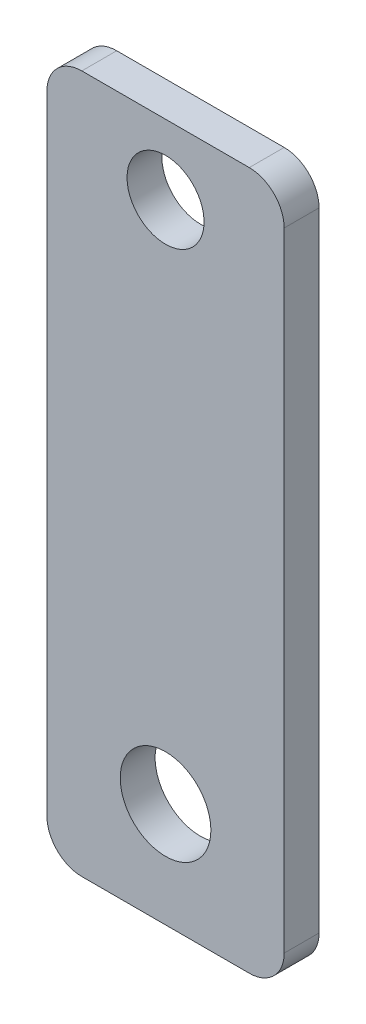
ISO-10303-21;
HEADER;
FILE_DESCRIPTION(('STEP AP214'),'2;1');
FILE_NAME('part.step','',(''),(''),'','','');
FILE_SCHEMA(('AUTOMOTIVE_DESIGN { 1 0 10303 214 1 1 1 1 }'));
ENDSEC;
DATA;
#1=APPLICATION_CONTEXT('core data for automotive mechanical design processes');
#2=APPLICATION_PROTOCOL_DEFINITION('international standard','automotive_design',2000,#1);
#3=PRODUCT_CONTEXT('',#1,'mechanical');
#4=PRODUCT('Part','Part','',(#3));
#5=PRODUCT_RELATED_PRODUCT_CATEGORY('part','',(#4));
#6=PRODUCT_DEFINITION_FORMATION('','',#4);
#7=PRODUCT_DEFINITION_CONTEXT('part definition',#1,'design');
#8=PRODUCT_DEFINITION('design','',#6,#7);
#9=PRODUCT_DEFINITION_SHAPE('','',#8);
#10=(LENGTH_UNIT() NAMED_UNIT(*) SI_UNIT(.MILLI.,.METRE.));
#11=(NAMED_UNIT(*) PLANE_ANGLE_UNIT() SI_UNIT($,.RADIAN.));
#12=(NAMED_UNIT(*) SI_UNIT($,.STERADIAN.) SOLID_ANGLE_UNIT());
#13=UNCERTAINTY_MEASURE_WITH_UNIT(LENGTH_MEASURE(1.E-05),#10,'distance_accuracy_value','');
#14=(GEOMETRIC_REPRESENTATION_CONTEXT(3) GLOBAL_UNCERTAINTY_ASSIGNED_CONTEXT((#13)) GLOBAL_UNIT_ASSIGNED_CONTEXT((#10,
#11,#12)) REPRESENTATION_CONTEXT('',''));
#15=CARTESIAN_POINT('',(0.,0.,0.));
#16=DIRECTION('',(0.,0.,1.));
#17=DIRECTION('',(1.,0.,0.));
#18=AXIS2_PLACEMENT_3D('',#15,#16,#17);
#19=CARTESIAN_POINT('',(0.,0.,3.175));
#20=DIRECTION('',(0.,0.,-1.));
#21=DIRECTION('',(-1.,0.,0.));
#22=AXIS2_PLACEMENT_3D('',#19,#20,#21);
#23=PLANE('',#22);
#24=CARTESIAN_POINT('',(10.795,57.15,3.175));
#25=DIRECTION('',(0.,0.,-1.));
#26=DIRECTION('',(-1.,0.,0.));
#27=AXIS2_PLACEMENT_3D('',#24,#25,#26);
#28=CIRCLE('',#27,3.5052);
#29=CARTESIAN_POINT('',(7.2898,57.15,3.175));
#30=VERTEX_POINT('',#29);
#31=EDGE_CURVE('E257',#30,#30,#28,.T.);
#32=ORIENTED_EDGE('',*,*,#31,.T.);
#33=EDGE_LOOP('',(#32));
#34=FACE_BOUND('',#33,.T.);
#35=DIRECTION('',(0.,1.,0.));
#36=VECTOR('',#35,1.);
#37=CARTESIAN_POINT('',(21.59,0.,3.175));
#38=LINE('',#37,#36);
#39=CARTESIAN_POINT('',(21.59,3.175,3.175));
#40=VERTEX_POINT('',#39);
#41=CARTESIAN_POINT('',(21.59,60.325,3.175));
#42=VERTEX_POINT('',#41);
#43=EDGE_CURVE('E162',#40,#42,#38,.T.);
#44=ORIENTED_EDGE('',*,*,#43,.T.);
#45=CARTESIAN_POINT('',(18.415,60.325,3.175));
#46=DIRECTION('',(0.,0.,-1.));
#47=DIRECTION('',(-1.,0.,0.));
#48=AXIS2_PLACEMENT_3D('',#45,#46,#47);
#49=CIRCLE('',#48,3.175);
#50=CARTESIAN_POINT('',(18.415,63.5,3.175));
#51=VERTEX_POINT('',#50);
#52=EDGE_CURVE('E180',#42,#51,#49,.F.);
#53=ORIENTED_EDGE('',*,*,#52,.T.);
#54=DIRECTION('',(1.,0.,0.));
#55=VECTOR('',#54,1.);
#56=CARTESIAN_POINT('',(0.,63.5,3.175));
#57=LINE('',#56,#55);
#58=CARTESIAN_POINT('',(3.175,63.5,3.175));
#59=VERTEX_POINT('',#58);
#60=EDGE_CURVE('E190',#59,#51,#57,.T.);
#61=ORIENTED_EDGE('',*,*,#60,.F.);
#62=CARTESIAN_POINT('',(3.175,60.325,3.175));
#63=DIRECTION('',(0.,0.,-1.));
#64=DIRECTION('',(-1.,0.,0.));
#65=AXIS2_PLACEMENT_3D('',#62,#63,#64);
#66=CIRCLE('',#65,3.175);
#67=CARTESIAN_POINT('',(0.,60.325,3.175));
#68=VERTEX_POINT('',#67);
#69=EDGE_CURVE('E157',#59,#68,#66,.F.);
#70=ORIENTED_EDGE('',*,*,#69,.T.);
#71=DIRECTION('',(0.,1.,0.));
#72=VECTOR('',#71,1.);
#73=CARTESIAN_POINT('',(0.,0.,3.175));
#74=LINE('',#73,#72);
#75=CARTESIAN_POINT('',(0.,3.175,3.175));
#76=VERTEX_POINT('',#75);
#77=EDGE_CURVE('E189',#76,#68,#74,.T.);
#78=ORIENTED_EDGE('',*,*,#77,.F.);
#79=CARTESIAN_POINT('',(3.175,3.175,3.175));
#80=DIRECTION('',(0.,0.,-1.));
#81=DIRECTION('',(-1.,0.,0.));
#82=AXIS2_PLACEMENT_3D('',#79,#80,#81);
#83=CIRCLE('',#82,3.175);
#84=CARTESIAN_POINT('',(3.175,0.,3.175));
#85=VERTEX_POINT('',#84);
#86=EDGE_CURVE('E86',#76,#85,#83,.F.);
#87=ORIENTED_EDGE('',*,*,#86,.T.);
#88=DIRECTION('',(1.,0.,0.));
#89=VECTOR('',#88,1.);
#90=CARTESIAN_POINT('',(0.,0.,3.175));
#91=LINE('',#90,#89);
#92=CARTESIAN_POINT('',(18.415,0.,3.175));
#93=VERTEX_POINT('',#92);
#94=EDGE_CURVE('E158',#85,#93,#91,.T.);
#95=ORIENTED_EDGE('',*,*,#94,.T.);
#96=CARTESIAN_POINT('',(18.415,3.175,3.175));
#97=DIRECTION('',(0.,0.,-1.));
#98=DIRECTION('',(-1.,0.,0.));
#99=AXIS2_PLACEMENT_3D('',#96,#97,#98);
#100=CIRCLE('',#99,3.175);
#101=EDGE_CURVE('E176',#93,#40,#100,.F.);
#102=ORIENTED_EDGE('',*,*,#101,.T.);
#103=EDGE_LOOP('',(#44,#53,#61,#70,#78,#87,#95,#102));
#104=FACE_BOUND('',#103,.T.);
#105=CARTESIAN_POINT('',(10.795,9.525,3.175));
#106=DIRECTION('',(0.,0.,1.));
#107=DIRECTION('',(1.,0.,0.));
#108=AXIS2_PLACEMENT_3D('',#105,#106,#107);
#109=CIRCLE('',#108,4.12499987799996);
#110=CARTESIAN_POINT('',(14.919999878,9.525,3.175));
#111=VERTEX_POINT('',#110);
#112=EDGE_CURVE('E199',#111,#111,#109,.T.);
#113=ORIENTED_EDGE('',*,*,#112,.F.);
#114=EDGE_LOOP('',(#113));
#115=FACE_BOUND('',#114,.T.);
#116=ADVANCED_FACE('F65',(#34,#104,#115),#23,.F.);
#117=CARTESIAN_POINT('',(0.,0.,0.));
#118=DIRECTION('',(0.,0.,-1.));
#119=DIRECTION('',(-1.,0.,0.));
#120=AXIS2_PLACEMENT_3D('',#117,#118,#119);
#121=PLANE('',#120);
#122=CARTESIAN_POINT('',(10.795,57.15,0.));
#123=DIRECTION('',(0.,0.,-1.));
#124=DIRECTION('',(-1.,0.,0.));
#125=AXIS2_PLACEMENT_3D('',#122,#123,#124);
#126=CIRCLE('',#125,3.5052);
#127=CARTESIAN_POINT('',(7.2898,57.15,0.));
#128=VERTEX_POINT('',#127);
#129=EDGE_CURVE('E260',#128,#128,#126,.T.);
#130=ORIENTED_EDGE('',*,*,#129,.F.);
#131=EDGE_LOOP('',(#130));
#132=FACE_BOUND('',#131,.T.);
#133=DIRECTION('',(1.,0.,0.));
#134=VECTOR('',#133,1.);
#135=CARTESIAN_POINT('',(0.,63.5,0.));
#136=LINE('',#135,#134);
#137=CARTESIAN_POINT('',(3.175,63.5,0.));
#138=VERTEX_POINT('',#137);
#139=CARTESIAN_POINT('',(18.415,63.5,0.));
#140=VERTEX_POINT('',#139);
#141=EDGE_CURVE('E135',#138,#140,#136,.T.);
#142=ORIENTED_EDGE('',*,*,#141,.T.);
#143=CARTESIAN_POINT('',(18.415,60.325,0.));
#144=DIRECTION('',(0.,0.,-1.));
#145=DIRECTION('',(-1.,0.,0.));
#146=AXIS2_PLACEMENT_3D('',#143,#144,#145);
#147=CIRCLE('',#146,3.175);
#148=CARTESIAN_POINT('',(21.59,60.325,0.));
#149=VERTEX_POINT('',#148);
#150=EDGE_CURVE('E142',#140,#149,#147,.T.);
#151=ORIENTED_EDGE('',*,*,#150,.T.);
#152=DIRECTION('',(0.,1.,0.));
#153=VECTOR('',#152,1.);
#154=CARTESIAN_POINT('',(21.59,0.,0.));
#155=LINE('',#154,#153);
#156=CARTESIAN_POINT('',(21.59,3.175,0.));
#157=VERTEX_POINT('',#156);
#158=EDGE_CURVE('E153',#157,#149,#155,.T.);
#159=ORIENTED_EDGE('',*,*,#158,.F.);
#160=CARTESIAN_POINT('',(18.415,3.175,0.));
#161=DIRECTION('',(0.,0.,-1.));
#162=DIRECTION('',(-1.,0.,0.));
#163=AXIS2_PLACEMENT_3D('',#160,#161,#162);
#164=CIRCLE('',#163,3.175);
#165=CARTESIAN_POINT('',(18.415,0.,0.));
#166=VERTEX_POINT('',#165);
#167=EDGE_CURVE('E160',#157,#166,#164,.T.);
#168=ORIENTED_EDGE('',*,*,#167,.T.);
#169=DIRECTION('',(1.,0.,0.));
#170=VECTOR('',#169,1.);
#171=CARTESIAN_POINT('',(0.,0.,0.));
#172=LINE('',#171,#170);
#173=CARTESIAN_POINT('',(3.175,0.,0.));
#174=VERTEX_POINT('',#173);
#175=EDGE_CURVE('E165',#174,#166,#172,.T.);
#176=ORIENTED_EDGE('',*,*,#175,.F.);
#177=CARTESIAN_POINT('',(3.175,3.175,0.));
#178=DIRECTION('',(0.,0.,-1.));
#179=DIRECTION('',(-1.,0.,0.));
#180=AXIS2_PLACEMENT_3D('',#177,#178,#179);
#181=CIRCLE('',#180,3.175);
#182=CARTESIAN_POINT('',(0.,3.175,0.));
#183=VERTEX_POINT('',#182);
#184=EDGE_CURVE('E143',#174,#183,#181,.T.);
#185=ORIENTED_EDGE('',*,*,#184,.T.);
#186=DIRECTION('',(0.,1.,0.));
#187=VECTOR('',#186,1.);
#188=CARTESIAN_POINT('',(0.,0.,0.));
#189=LINE('',#188,#187);
#190=CARTESIAN_POINT('',(0.,60.325,0.));
#191=VERTEX_POINT('',#190);
#192=EDGE_CURVE('E137',#183,#191,#189,.T.);
#193=ORIENTED_EDGE('',*,*,#192,.T.);
#194=CARTESIAN_POINT('',(3.175,60.325,0.));
#195=DIRECTION('',(0.,0.,-1.));
#196=DIRECTION('',(-1.,0.,0.));
#197=AXIS2_PLACEMENT_3D('',#194,#195,#196);
#198=CIRCLE('',#197,3.175);
#199=EDGE_CURVE('E131',#191,#138,#198,.T.);
#200=ORIENTED_EDGE('',*,*,#199,.T.);
#201=EDGE_LOOP('',(#142,#151,#159,#168,#176,#185,#193,#200));
#202=FACE_BOUND('',#201,.T.);
#203=CARTESIAN_POINT('',(10.795,9.525,0.));
#204=DIRECTION('',(0.,0.,1.));
#205=DIRECTION('',(1.,0.,0.));
#206=AXIS2_PLACEMENT_3D('',#203,#204,#205);
#207=CIRCLE('',#206,4.12499987799996);
#208=CARTESIAN_POINT('',(14.919999878,9.525,0.));
#209=VERTEX_POINT('',#208);
#210=EDGE_CURVE('E194',#209,#209,#207,.T.);
#211=ORIENTED_EDGE('',*,*,#210,.T.);
#212=EDGE_LOOP('',(#211));
#213=FACE_BOUND('',#212,.T.);
#214=ADVANCED_FACE('F133',(#132,#202,#213),#121,.T.);
#215=CARTESIAN_POINT('',(0.,0.,3.175));
#216=DIRECTION('',(-1.,0.,0.));
#217=DIRECTION('',(0.,0.,1.));
#218=AXIS2_PLACEMENT_3D('',#215,#216,#217);
#219=PLANE('',#218);
#220=ORIENTED_EDGE('',*,*,#77,.T.);
#221=DIRECTION('',(0.,0.,-1.));
#222=VECTOR('',#221,1.);
#223=CARTESIAN_POINT('',(0.,60.325,3.175));
#224=LINE('',#223,#222);
#225=EDGE_CURVE('E184',#68,#191,#224,.T.);
#226=ORIENTED_EDGE('',*,*,#225,.T.);
#227=ORIENTED_EDGE('',*,*,#192,.F.);
#228=DIRECTION('',(0.,0.,-1.));
#229=VECTOR('',#228,1.);
#230=CARTESIAN_POINT('',(0.,3.175,3.175));
#231=LINE('',#230,#229);
#232=EDGE_CURVE('E182',#183,#76,#231,.F.);
#233=ORIENTED_EDGE('',*,*,#232,.T.);
#234=EDGE_LOOP('',(#220,#226,#227,#233));
#235=FACE_BOUND('',#234,.T.);
#236=ADVANCED_FACE('F187',(#235),#219,.T.);
#237=CARTESIAN_POINT('',(0.,0.,3.175));
#238=DIRECTION('',(0.,1.,0.));
#239=DIRECTION('',(0.,0.,1.));
#240=AXIS2_PLACEMENT_3D('',#237,#238,#239);
#241=PLANE('',#240);
#242=ORIENTED_EDGE('',*,*,#94,.F.);
#243=DIRECTION('',(0.,0.,-1.));
#244=VECTOR('',#243,1.);
#245=CARTESIAN_POINT('',(3.175,0.,0.));
#246=LINE('',#245,#244);
#247=EDGE_CURVE('E12',#85,#174,#246,.T.);
#248=ORIENTED_EDGE('',*,*,#247,.T.);
#249=ORIENTED_EDGE('',*,*,#175,.T.);
#250=DIRECTION('',(0.,0.,-1.));
#251=VECTOR('',#250,1.);
#252=CARTESIAN_POINT('',(18.415,0.,3.175));
#253=LINE('',#252,#251);
#254=EDGE_CURVE('E73',#166,#93,#253,.F.);
#255=ORIENTED_EDGE('',*,*,#254,.T.);
#256=EDGE_LOOP('',(#242,#248,#249,#255));
#257=FACE_BOUND('',#256,.T.);
#258=ADVANCED_FACE('F214',(#257),#241,.F.);
#259=CARTESIAN_POINT('',(21.59,0.,3.175));
#260=DIRECTION('',(-1.,0.,0.));
#261=DIRECTION('',(0.,0.,1.));
#262=AXIS2_PLACEMENT_3D('',#259,#260,#261);
#263=PLANE('',#262);
#264=ORIENTED_EDGE('',*,*,#158,.T.);
#265=DIRECTION('',(0.,0.,-1.));
#266=VECTOR('',#265,1.);
#267=CARTESIAN_POINT('',(21.59,60.325,3.175));
#268=LINE('',#267,#266);
#269=EDGE_CURVE('E174',#149,#42,#268,.F.);
#270=ORIENTED_EDGE('',*,*,#269,.T.);
#271=ORIENTED_EDGE('',*,*,#43,.F.);
#272=DIRECTION('',(0.,0.,-1.));
#273=VECTOR('',#272,1.);
#274=CARTESIAN_POINT('',(21.59,3.175,3.175));
#275=LINE('',#274,#273);
#276=EDGE_CURVE('E171',#40,#157,#275,.T.);
#277=ORIENTED_EDGE('',*,*,#276,.T.);
#278=EDGE_LOOP('',(#264,#270,#271,#277));
#279=FACE_BOUND('',#278,.T.);
#280=ADVANCED_FACE('F204',(#279),#263,.F.);
#281=CARTESIAN_POINT('',(0.,63.5,3.175));
#282=DIRECTION('',(0.,1.,0.));
#283=DIRECTION('',(0.,0.,1.));
#284=AXIS2_PLACEMENT_3D('',#281,#282,#283);
#285=PLANE('',#284);
#286=ORIENTED_EDGE('',*,*,#60,.T.);
#287=DIRECTION('',(0.,0.,-1.));
#288=VECTOR('',#287,1.);
#289=CARTESIAN_POINT('',(18.415,63.5,0.));
#290=LINE('',#289,#288);
#291=EDGE_CURVE('E152',#51,#140,#290,.T.);
#292=ORIENTED_EDGE('',*,*,#291,.T.);
#293=ORIENTED_EDGE('',*,*,#141,.F.);
#294=DIRECTION('',(0.,0.,-1.));
#295=VECTOR('',#294,1.);
#296=CARTESIAN_POINT('',(3.175,63.5,3.175));
#297=LINE('',#296,#295);
#298=EDGE_CURVE('E149',#138,#59,#297,.F.);
#299=ORIENTED_EDGE('',*,*,#298,.T.);
#300=EDGE_LOOP('',(#286,#292,#293,#299));
#301=FACE_BOUND('',#300,.T.);
#302=ADVANCED_FACE('F148',(#301),#285,.T.);
#303=CARTESIAN_POINT('',(10.795,9.525,3.175));
#304=DIRECTION('',(0.,0.,-1.));
#305=DIRECTION('',(-1.,0.,0.));
#306=AXIS2_PLACEMENT_3D('',#303,#304,#305);
#307=CYLINDRICAL_SURFACE('',#306,4.12499987799996);
#308=ORIENTED_EDGE('',*,*,#112,.T.);
#309=EDGE_LOOP('',(#308));
#310=FACE_BOUND('',#309,.T.);
#311=ORIENTED_EDGE('',*,*,#210,.F.);
#312=EDGE_LOOP('',(#311));
#313=FACE_BOUND('',#312,.T.);
#314=ADVANCED_FACE('F234',(#310,#313),#307,.F.);
#315=CARTESIAN_POINT('',(10.795,57.15,3.175));
#316=DIRECTION('',(0.,0.,-1.));
#317=DIRECTION('',(-1.,0.,0.));
#318=AXIS2_PLACEMENT_3D('',#315,#316,#317);
#319=CYLINDRICAL_SURFACE('',#318,3.5052);
#320=ORIENTED_EDGE('',*,*,#31,.F.);
#321=EDGE_LOOP('',(#320));
#322=FACE_BOUND('',#321,.T.);
#323=ORIENTED_EDGE('',*,*,#129,.T.);
#324=EDGE_LOOP('',(#323));
#325=FACE_BOUND('',#324,.T.);
#326=ADVANCED_FACE('F246',(#322,#325),#319,.F.);
#327=CARTESIAN_POINT('',(18.415,60.325,3.175));
#328=DIRECTION('',(0.,0.,1.));
#329=DIRECTION('',(1.,0.,0.));
#330=AXIS2_PLACEMENT_3D('',#327,#328,#329);
#331=CYLINDRICAL_SURFACE('',#330,3.175);
#332=ORIENTED_EDGE('',*,*,#52,.F.);
#333=ORIENTED_EDGE('',*,*,#269,.F.);
#334=ORIENTED_EDGE('',*,*,#150,.F.);
#335=ORIENTED_EDGE('',*,*,#291,.F.);
#336=EDGE_LOOP('',(#332,#333,#334,#335));
#337=FACE_BOUND('',#336,.T.);
#338=ADVANCED_FACE('F209',(#337),#331,.T.);
#339=CARTESIAN_POINT('',(3.175,60.325,3.175));
#340=DIRECTION('',(0.,0.,-1.));
#341=DIRECTION('',(-1.,0.,0.));
#342=AXIS2_PLACEMENT_3D('',#339,#340,#341);
#343=CYLINDRICAL_SURFACE('',#342,3.175);
#344=ORIENTED_EDGE('',*,*,#69,.F.);
#345=ORIENTED_EDGE('',*,*,#298,.F.);
#346=ORIENTED_EDGE('',*,*,#199,.F.);
#347=ORIENTED_EDGE('',*,*,#225,.F.);
#348=EDGE_LOOP('',(#344,#345,#346,#347));
#349=FACE_BOUND('',#348,.T.);
#350=ADVANCED_FACE('F156',(#349),#343,.T.);
#351=CARTESIAN_POINT('',(3.175,3.175,3.175));
#352=DIRECTION('',(0.,0.,1.));
#353=DIRECTION('',(1.,0.,0.));
#354=AXIS2_PLACEMENT_3D('',#351,#352,#353);
#355=CYLINDRICAL_SURFACE('',#354,3.175);
#356=ORIENTED_EDGE('',*,*,#86,.F.);
#357=ORIENTED_EDGE('',*,*,#232,.F.);
#358=ORIENTED_EDGE('',*,*,#184,.F.);
#359=ORIENTED_EDGE('',*,*,#247,.F.);
#360=EDGE_LOOP('',(#356,#357,#358,#359));
#361=FACE_BOUND('',#360,.T.);
#362=ADVANCED_FACE('F217',(#361),#355,.T.);
#363=CARTESIAN_POINT('',(18.415,3.175,3.175));
#364=DIRECTION('',(0.,0.,-1.));
#365=DIRECTION('',(-1.,0.,0.));
#366=AXIS2_PLACEMENT_3D('',#363,#364,#365);
#367=CYLINDRICAL_SURFACE('',#366,3.175);
#368=ORIENTED_EDGE('',*,*,#101,.F.);
#369=ORIENTED_EDGE('',*,*,#254,.F.);
#370=ORIENTED_EDGE('',*,*,#167,.F.);
#371=ORIENTED_EDGE('',*,*,#276,.F.);
#372=EDGE_LOOP('',(#368,#369,#370,#371));
#373=FACE_BOUND('',#372,.T.);
#374=ADVANCED_FACE('F67',(#373),#367,.T.);
#375=CLOSED_SHELL('',(#116,#214,#236,#258,#280,#302,#314,#326,#338,#350,#362,#374));
#376=MANIFOLD_SOLID_BREP('B2',#375);
#377=ADVANCED_BREP_SHAPE_REPRESENTATION('',(#18,#376),#14);
#378=SHAPE_DEFINITION_REPRESENTATION(#9,#377);
ENDSEC;
END-ISO-10303-21;
